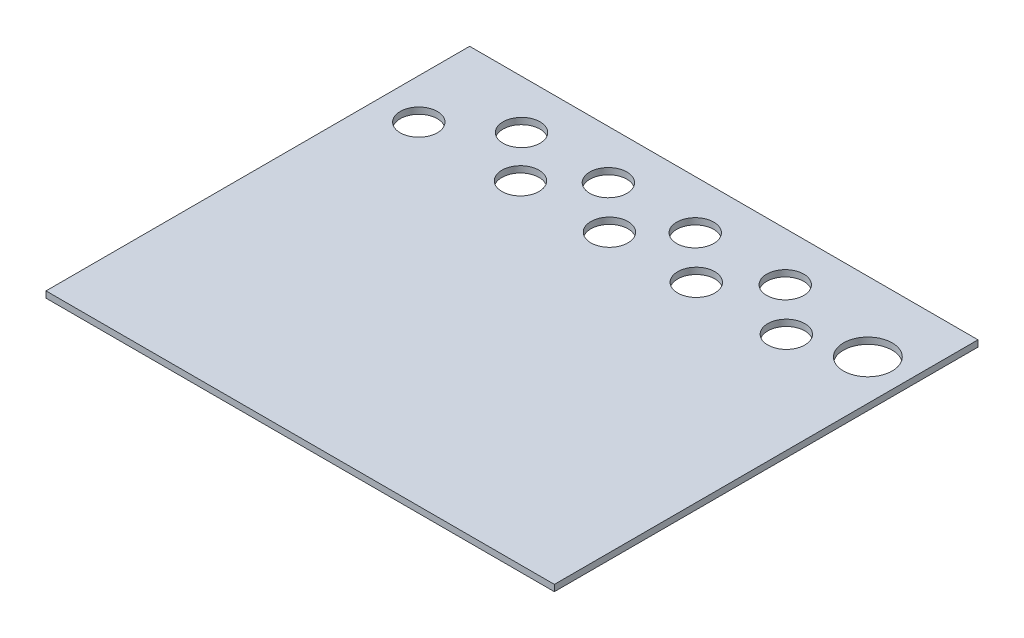
ISO-10303-21;
HEADER;
FILE_DESCRIPTION(('STEP AP214'),'2;1');
FILE_NAME('part.step','',(''),(''),'','','');
FILE_SCHEMA(('AUTOMOTIVE_DESIGN { 1 0 10303 214 1 1 1 1 }'));
ENDSEC;
DATA;
#1=APPLICATION_CONTEXT('core data for automotive mechanical design processes');
#2=APPLICATION_PROTOCOL_DEFINITION('international standard','automotive_design',2000,#1);
#3=PRODUCT_CONTEXT('',#1,'mechanical');
#4=PRODUCT('Part','Part','',(#3));
#5=PRODUCT_RELATED_PRODUCT_CATEGORY('part','',(#4));
#6=PRODUCT_DEFINITION_FORMATION('','',#4);
#7=PRODUCT_DEFINITION_CONTEXT('part definition',#1,'design');
#8=PRODUCT_DEFINITION('design','',#6,#7);
#9=PRODUCT_DEFINITION_SHAPE('','',#8);
#10=(LENGTH_UNIT() NAMED_UNIT(*) SI_UNIT(.MILLI.,.METRE.));
#11=(NAMED_UNIT(*) PLANE_ANGLE_UNIT() SI_UNIT($,.RADIAN.));
#12=(NAMED_UNIT(*) SI_UNIT($,.STERADIAN.) SOLID_ANGLE_UNIT());
#13=UNCERTAINTY_MEASURE_WITH_UNIT(LENGTH_MEASURE(1.E-05),#10,'distance_accuracy_value','');
#14=(GEOMETRIC_REPRESENTATION_CONTEXT(3) GLOBAL_UNCERTAINTY_ASSIGNED_CONTEXT((#13)) GLOBAL_UNIT_ASSIGNED_CONTEXT((#10,
#11,#12)) REPRESENTATION_CONTEXT('',''));
#15=CARTESIAN_POINT('',(0.,0.,0.));
#16=DIRECTION('',(0.,0.,1.));
#17=DIRECTION('',(1.,0.,0.));
#18=AXIS2_PLACEMENT_3D('',#15,#16,#17);
#19=CARTESIAN_POINT('',(0.,3.,0.));
#20=DIRECTION('',(1.,0.,0.));
#21=DIRECTION('',(0.,0.,-1.));
#22=AXIS2_PLACEMENT_3D('',#19,#20,#21);
#23=PLANE('',#22);
#24=DIRECTION('',(0.,0.,1.));
#25=VECTOR('',#24,1.);
#26=CARTESIAN_POINT('',(0.,0.,0.));
#27=LINE('',#26,#25);
#28=CARTESIAN_POINT('',(0.,0.,-200.));
#29=VERTEX_POINT('',#28);
#30=CARTESIAN_POINT('',(0.,0.,0.));
#31=VERTEX_POINT('',#30);
#32=EDGE_CURVE('E96',#29,#31,#27,.T.);
#33=ORIENTED_EDGE('',*,*,#32,.T.);
#34=DIRECTION('',(0.,-1.,0.));
#35=VECTOR('',#34,1.);
#36=CARTESIAN_POINT('',(0.,3.,0.));
#37=LINE('',#36,#35);
#38=CARTESIAN_POINT('',(0.,3.,0.));
#39=VERTEX_POINT('',#38);
#40=EDGE_CURVE('E11',#39,#31,#37,.T.);
#41=ORIENTED_EDGE('',*,*,#40,.F.);
#42=DIRECTION('',(0.,0.,1.));
#43=VECTOR('',#42,1.);
#44=CARTESIAN_POINT('',(0.,3.,0.));
#45=LINE('',#44,#43);
#46=CARTESIAN_POINT('',(0.,3.,-200.));
#47=VERTEX_POINT('',#46);
#48=EDGE_CURVE('E84',#47,#39,#45,.T.);
#49=ORIENTED_EDGE('',*,*,#48,.F.);
#50=DIRECTION('',(0.,-1.,0.));
#51=VECTOR('',#50,1.);
#52=CARTESIAN_POINT('',(0.,3.,-200.));
#53=LINE('',#52,#51);
#54=EDGE_CURVE('E92',#47,#29,#53,.T.);
#55=ORIENTED_EDGE('',*,*,#54,.T.);
#56=EDGE_LOOP('',(#33,#41,#49,#55));
#57=FACE_BOUND('',#56,.T.);
#58=ADVANCED_FACE('F33',(#57),#23,.F.);
#59=CARTESIAN_POINT('',(0.,3.,0.));
#60=DIRECTION('',(0.,0.,-1.));
#61=DIRECTION('',(-1.,0.,0.));
#62=AXIS2_PLACEMENT_3D('',#59,#60,#61);
#63=PLANE('',#62);
#64=DIRECTION('',(1.,0.,0.));
#65=VECTOR('',#64,1.);
#66=CARTESIAN_POINT('',(0.,0.,0.));
#67=LINE('',#66,#65);
#68=CARTESIAN_POINT('',(240.,0.,0.));
#69=VERTEX_POINT('',#68);
#70=EDGE_CURVE('E88',#31,#69,#67,.T.);
#71=ORIENTED_EDGE('',*,*,#70,.T.);
#72=DIRECTION('',(0.,-1.,0.));
#73=VECTOR('',#72,1.);
#74=CARTESIAN_POINT('',(240.,3.,0.));
#75=LINE('',#74,#73);
#76=CARTESIAN_POINT('',(240.,3.,0.));
#77=VERTEX_POINT('',#76);
#78=EDGE_CURVE('E41',#77,#69,#75,.T.);
#79=ORIENTED_EDGE('',*,*,#78,.F.);
#80=DIRECTION('',(1.,0.,0.));
#81=VECTOR('',#80,1.);
#82=CARTESIAN_POINT('',(0.,3.,0.));
#83=LINE('',#82,#81);
#84=EDGE_CURVE('E79',#39,#77,#83,.T.);
#85=ORIENTED_EDGE('',*,*,#84,.F.);
#86=ORIENTED_EDGE('',*,*,#40,.T.);
#87=EDGE_LOOP('',(#71,#79,#85,#86));
#88=FACE_BOUND('',#87,.T.);
#89=ADVANCED_FACE('F87',(#88),#63,.F.);
#90=CARTESIAN_POINT('',(240.,3.,0.));
#91=DIRECTION('',(-1.,0.,0.));
#92=DIRECTION('',(0.,0.,1.));
#93=AXIS2_PLACEMENT_3D('',#90,#91,#92);
#94=PLANE('',#93);
#95=DIRECTION('',(0.,0.,-1.));
#96=VECTOR('',#95,1.);
#97=CARTESIAN_POINT('',(240.,0.,0.));
#98=LINE('',#97,#96);
#99=CARTESIAN_POINT('',(240.,0.,-200.));
#100=VERTEX_POINT('',#99);
#101=EDGE_CURVE('E66',#69,#100,#98,.T.);
#102=ORIENTED_EDGE('',*,*,#101,.T.);
#103=DIRECTION('',(0.,-1.,0.));
#104=VECTOR('',#103,1.);
#105=CARTESIAN_POINT('',(240.,3.,-200.));
#106=LINE('',#105,#104);
#107=CARTESIAN_POINT('',(240.,3.,-200.));
#108=VERTEX_POINT('',#107);
#109=EDGE_CURVE('E89',#108,#100,#106,.T.);
#110=ORIENTED_EDGE('',*,*,#109,.F.);
#111=DIRECTION('',(0.,0.,-1.));
#112=VECTOR('',#111,1.);
#113=CARTESIAN_POINT('',(240.,3.,0.));
#114=LINE('',#113,#112);
#115=EDGE_CURVE('E82',#77,#108,#114,.T.);
#116=ORIENTED_EDGE('',*,*,#115,.F.);
#117=ORIENTED_EDGE('',*,*,#78,.T.);
#118=EDGE_LOOP('',(#102,#110,#116,#117));
#119=FACE_BOUND('',#118,.T.);
#120=ADVANCED_FACE('F90',(#119),#94,.F.);
#121=CARTESIAN_POINT('',(0.,3.,-200.));
#122=DIRECTION('',(0.,0.,1.));
#123=DIRECTION('',(1.,0.,0.));
#124=AXIS2_PLACEMENT_3D('',#121,#122,#123);
#125=PLANE('',#124);
#126=DIRECTION('',(-1.,0.,0.));
#127=VECTOR('',#126,1.);
#128=CARTESIAN_POINT('',(0.,0.,-200.));
#129=LINE('',#128,#127);
#130=EDGE_CURVE('E72',#100,#29,#129,.T.);
#131=ORIENTED_EDGE('',*,*,#130,.T.);
#132=ORIENTED_EDGE('',*,*,#54,.F.);
#133=DIRECTION('',(-1.,0.,0.));
#134=VECTOR('',#133,1.);
#135=CARTESIAN_POINT('',(0.,3.,-200.));
#136=LINE('',#135,#134);
#137=EDGE_CURVE('E49',#108,#47,#136,.T.);
#138=ORIENTED_EDGE('',*,*,#137,.F.);
#139=ORIENTED_EDGE('',*,*,#109,.T.);
#140=EDGE_LOOP('',(#131,#132,#138,#139));
#141=FACE_BOUND('',#140,.T.);
#142=ADVANCED_FACE('F104',(#141),#125,.F.);
#143=CARTESIAN_POINT('',(0.,3.,0.));
#144=DIRECTION('',(0.,-1.,0.));
#145=DIRECTION('',(0.,0.,-1.));
#146=AXIS2_PLACEMENT_3D('',#143,#144,#145);
#147=PLANE('',#146);
#148=CARTESIAN_POINT('',(221.,3.,-167.));
#149=DIRECTION('',(0.,1.,0.));
#150=DIRECTION('',(0.,0.,1.));
#151=AXIS2_PLACEMENT_3D('',#148,#149,#150);
#152=CIRCLE('',#151,11.5);
#153=CARTESIAN_POINT('',(221.,3.,-155.5));
#154=VERTEX_POINT('',#153);
#155=EDGE_CURVE('E166',#154,#154,#152,.T.);
#156=ORIENTED_EDGE('',*,*,#155,.F.);
#157=EDGE_LOOP('',(#156));
#158=FACE_BOUND('',#157,.T.);
#159=CARTESIAN_POINT('',(19.,3.,-157.));
#160=DIRECTION('',(0.,1.,0.));
#161=DIRECTION('',(0.,0.,1.));
#162=AXIS2_PLACEMENT_3D('',#159,#160,#161);
#163=CIRCLE('',#162,8.75);
#164=CARTESIAN_POINT('',(19.,3.,-148.25));
#165=VERTEX_POINT('',#164);
#166=EDGE_CURVE('E160',#165,#165,#163,.T.);
#167=ORIENTED_EDGE('',*,*,#166,.F.);
#168=EDGE_LOOP('',(#167));
#169=FACE_BOUND('',#168,.T.);
#170=CARTESIAN_POINT('',(47.5,3.,-177.));
#171=DIRECTION('',(0.,1.,0.));
#172=DIRECTION('',(0.,0.,1.));
#173=AXIS2_PLACEMENT_3D('',#170,#171,#172);
#174=CIRCLE('',#173,8.75);
#175=CARTESIAN_POINT('',(47.5,3.,-168.25));
#176=VERTEX_POINT('',#175);
#177=EDGE_CURVE('E154',#176,#176,#174,.T.);
#178=ORIENTED_EDGE('',*,*,#177,.F.);
#179=EDGE_LOOP('',(#178));
#180=FACE_BOUND('',#179,.T.);
#181=CARTESIAN_POINT('',(67.,3.,-157.));
#182=DIRECTION('',(0.,1.,0.));
#183=DIRECTION('',(0.,0.,1.));
#184=AXIS2_PLACEMENT_3D('',#181,#182,#183);
#185=CIRCLE('',#184,8.75000000000001);
#186=CARTESIAN_POINT('',(67.,3.,-148.25));
#187=VERTEX_POINT('',#186);
#188=EDGE_CURVE('E148',#187,#187,#185,.T.);
#189=ORIENTED_EDGE('',*,*,#188,.F.);
#190=EDGE_LOOP('',(#189));
#191=FACE_BOUND('',#190,.T.);
#192=CARTESIAN_POINT('',(88.5,3.,-177.));
#193=DIRECTION('',(0.,1.,0.));
#194=DIRECTION('',(0.,0.,1.));
#195=AXIS2_PLACEMENT_3D('',#192,#193,#194);
#196=CIRCLE('',#195,8.75000000000001);
#197=CARTESIAN_POINT('',(88.5,3.,-168.25));
#198=VERTEX_POINT('',#197);
#199=EDGE_CURVE('E142',#198,#198,#196,.T.);
#200=ORIENTED_EDGE('',*,*,#199,.F.);
#201=EDGE_LOOP('',(#200));
#202=FACE_BOUND('',#201,.T.);
#203=CARTESIAN_POINT('',(109.,3.,-157.));
#204=DIRECTION('',(0.,1.,0.));
#205=DIRECTION('',(0.,0.,1.));
#206=AXIS2_PLACEMENT_3D('',#203,#204,#205);
#207=CIRCLE('',#206,8.75000000000001);
#208=CARTESIAN_POINT('',(109.,3.,-148.25));
#209=VERTEX_POINT('',#208);
#210=EDGE_CURVE('E136',#209,#209,#207,.T.);
#211=ORIENTED_EDGE('',*,*,#210,.F.);
#212=EDGE_LOOP('',(#211));
#213=FACE_BOUND('',#212,.T.);
#214=CARTESIAN_POINT('',(129.5,3.,-177.));
#215=DIRECTION('',(0.,1.,0.));
#216=DIRECTION('',(0.,0.,1.));
#217=AXIS2_PLACEMENT_3D('',#214,#215,#216);
#218=CIRCLE('',#217,8.75000000000001);
#219=CARTESIAN_POINT('',(129.5,3.,-168.25));
#220=VERTEX_POINT('',#219);
#221=EDGE_CURVE('E130',#220,#220,#218,.T.);
#222=ORIENTED_EDGE('',*,*,#221,.F.);
#223=EDGE_LOOP('',(#222));
#224=FACE_BOUND('',#223,.T.);
#225=CARTESIAN_POINT('',(150.,3.,-157.));
#226=DIRECTION('',(0.,1.,0.));
#227=DIRECTION('',(0.,0.,1.));
#228=AXIS2_PLACEMENT_3D('',#225,#226,#227);
#229=CIRCLE('',#228,8.75000000000001);
#230=CARTESIAN_POINT('',(150.,3.,-148.25));
#231=VERTEX_POINT('',#230);
#232=EDGE_CURVE('E124',#231,#231,#229,.T.);
#233=ORIENTED_EDGE('',*,*,#232,.F.);
#234=EDGE_LOOP('',(#233));
#235=FACE_BOUND('',#234,.T.);
#236=CARTESIAN_POINT('',(172.,3.,-177.));
#237=DIRECTION('',(0.,1.,0.));
#238=DIRECTION('',(0.,0.,1.));
#239=AXIS2_PLACEMENT_3D('',#236,#237,#238);
#240=CIRCLE('',#239,8.75000000000001);
#241=CARTESIAN_POINT('',(172.,3.,-168.25));
#242=VERTEX_POINT('',#241);
#243=EDGE_CURVE('E118',#242,#242,#240,.T.);
#244=ORIENTED_EDGE('',*,*,#243,.F.);
#245=EDGE_LOOP('',(#244));
#246=FACE_BOUND('',#245,.T.);
#247=CARTESIAN_POINT('',(192.5,3.,-157.));
#248=DIRECTION('',(0.,1.,0.));
#249=DIRECTION('',(0.,0.,1.));
#250=AXIS2_PLACEMENT_3D('',#247,#248,#249);
#251=CIRCLE('',#250,8.75000000000001);
#252=CARTESIAN_POINT('',(192.5,3.,-148.25));
#253=VERTEX_POINT('',#252);
#254=EDGE_CURVE('E112',#253,#253,#251,.T.);
#255=ORIENTED_EDGE('',*,*,#254,.F.);
#256=EDGE_LOOP('',(#255));
#257=FACE_BOUND('',#256,.T.);
#258=ORIENTED_EDGE('',*,*,#48,.T.);
#259=ORIENTED_EDGE('',*,*,#84,.T.);
#260=ORIENTED_EDGE('',*,*,#115,.T.);
#261=ORIENTED_EDGE('',*,*,#137,.T.);
#262=EDGE_LOOP('',(#258,#259,#260,#261));
#263=FACE_BOUND('',#262,.T.);
#264=ADVANCED_FACE('F80',(#158,#169,#180,#191,#202,#213,#224,#235,#246,#257,#263),#147,.F.);
#265=CARTESIAN_POINT('',(0.,0.,0.));
#266=DIRECTION('',(0.,-1.,0.));
#267=DIRECTION('',(0.,0.,-1.));
#268=AXIS2_PLACEMENT_3D('',#265,#266,#267);
#269=PLANE('',#268);
#270=CARTESIAN_POINT('',(221.,0.,-167.));
#271=DIRECTION('',(0.,1.,0.));
#272=DIRECTION('',(0.,0.,1.));
#273=AXIS2_PLACEMENT_3D('',#270,#271,#272);
#274=CIRCLE('',#273,11.5);
#275=CARTESIAN_POINT('',(221.,0.,-155.5));
#276=VERTEX_POINT('',#275);
#277=EDGE_CURVE('E163',#276,#276,#274,.T.);
#278=ORIENTED_EDGE('',*,*,#277,.T.);
#279=EDGE_LOOP('',(#278));
#280=FACE_BOUND('',#279,.T.);
#281=CARTESIAN_POINT('',(19.,0.,-157.));
#282=DIRECTION('',(0.,1.,0.));
#283=DIRECTION('',(0.,0.,1.));
#284=AXIS2_PLACEMENT_3D('',#281,#282,#283);
#285=CIRCLE('',#284,8.75);
#286=CARTESIAN_POINT('',(19.,0.,-148.25));
#287=VERTEX_POINT('',#286);
#288=EDGE_CURVE('E157',#287,#287,#285,.T.);
#289=ORIENTED_EDGE('',*,*,#288,.T.);
#290=EDGE_LOOP('',(#289));
#291=FACE_BOUND('',#290,.T.);
#292=CARTESIAN_POINT('',(47.5,0.,-177.));
#293=DIRECTION('',(0.,1.,0.));
#294=DIRECTION('',(0.,0.,1.));
#295=AXIS2_PLACEMENT_3D('',#292,#293,#294);
#296=CIRCLE('',#295,8.75);
#297=CARTESIAN_POINT('',(47.5,0.,-168.25));
#298=VERTEX_POINT('',#297);
#299=EDGE_CURVE('E151',#298,#298,#296,.T.);
#300=ORIENTED_EDGE('',*,*,#299,.T.);
#301=EDGE_LOOP('',(#300));
#302=FACE_BOUND('',#301,.T.);
#303=CARTESIAN_POINT('',(67.,0.,-157.));
#304=DIRECTION('',(0.,1.,0.));
#305=DIRECTION('',(0.,0.,1.));
#306=AXIS2_PLACEMENT_3D('',#303,#304,#305);
#307=CIRCLE('',#306,8.75000000000001);
#308=CARTESIAN_POINT('',(67.,0.,-148.25));
#309=VERTEX_POINT('',#308);
#310=EDGE_CURVE('E145',#309,#309,#307,.T.);
#311=ORIENTED_EDGE('',*,*,#310,.T.);
#312=EDGE_LOOP('',(#311));
#313=FACE_BOUND('',#312,.T.);
#314=CARTESIAN_POINT('',(88.5,0.,-177.));
#315=DIRECTION('',(0.,1.,0.));
#316=DIRECTION('',(0.,0.,1.));
#317=AXIS2_PLACEMENT_3D('',#314,#315,#316);
#318=CIRCLE('',#317,8.75000000000001);
#319=CARTESIAN_POINT('',(88.5,0.,-168.25));
#320=VERTEX_POINT('',#319);
#321=EDGE_CURVE('E139',#320,#320,#318,.T.);
#322=ORIENTED_EDGE('',*,*,#321,.T.);
#323=EDGE_LOOP('',(#322));
#324=FACE_BOUND('',#323,.T.);
#325=CARTESIAN_POINT('',(109.,0.,-157.));
#326=DIRECTION('',(0.,1.,0.));
#327=DIRECTION('',(0.,0.,1.));
#328=AXIS2_PLACEMENT_3D('',#325,#326,#327);
#329=CIRCLE('',#328,8.75000000000001);
#330=CARTESIAN_POINT('',(109.,0.,-148.25));
#331=VERTEX_POINT('',#330);
#332=EDGE_CURVE('E133',#331,#331,#329,.T.);
#333=ORIENTED_EDGE('',*,*,#332,.T.);
#334=EDGE_LOOP('',(#333));
#335=FACE_BOUND('',#334,.T.);
#336=CARTESIAN_POINT('',(129.5,0.,-177.));
#337=DIRECTION('',(0.,1.,0.));
#338=DIRECTION('',(0.,0.,1.));
#339=AXIS2_PLACEMENT_3D('',#336,#337,#338);
#340=CIRCLE('',#339,8.75000000000001);
#341=CARTESIAN_POINT('',(129.5,0.,-168.25));
#342=VERTEX_POINT('',#341);
#343=EDGE_CURVE('E127',#342,#342,#340,.T.);
#344=ORIENTED_EDGE('',*,*,#343,.T.);
#345=EDGE_LOOP('',(#344));
#346=FACE_BOUND('',#345,.T.);
#347=CARTESIAN_POINT('',(150.,0.,-157.));
#348=DIRECTION('',(0.,1.,0.));
#349=DIRECTION('',(0.,0.,1.));
#350=AXIS2_PLACEMENT_3D('',#347,#348,#349);
#351=CIRCLE('',#350,8.75000000000001);
#352=CARTESIAN_POINT('',(150.,0.,-148.25));
#353=VERTEX_POINT('',#352);
#354=EDGE_CURVE('E121',#353,#353,#351,.T.);
#355=ORIENTED_EDGE('',*,*,#354,.T.);
#356=EDGE_LOOP('',(#355));
#357=FACE_BOUND('',#356,.T.);
#358=CARTESIAN_POINT('',(172.,0.,-177.));
#359=DIRECTION('',(0.,1.,0.));
#360=DIRECTION('',(0.,0.,1.));
#361=AXIS2_PLACEMENT_3D('',#358,#359,#360);
#362=CIRCLE('',#361,8.75000000000001);
#363=CARTESIAN_POINT('',(172.,0.,-168.25));
#364=VERTEX_POINT('',#363);
#365=EDGE_CURVE('E115',#364,#364,#362,.T.);
#366=ORIENTED_EDGE('',*,*,#365,.T.);
#367=EDGE_LOOP('',(#366));
#368=FACE_BOUND('',#367,.T.);
#369=CARTESIAN_POINT('',(192.5,0.,-157.));
#370=DIRECTION('',(0.,1.,0.));
#371=DIRECTION('',(0.,0.,1.));
#372=AXIS2_PLACEMENT_3D('',#369,#370,#371);
#373=CIRCLE('',#372,8.75000000000001);
#374=CARTESIAN_POINT('',(192.5,0.,-148.25));
#375=VERTEX_POINT('',#374);
#376=EDGE_CURVE('E99',#375,#375,#373,.T.);
#377=ORIENTED_EDGE('',*,*,#376,.T.);
#378=EDGE_LOOP('',(#377));
#379=FACE_BOUND('',#378,.T.);
#380=ORIENTED_EDGE('',*,*,#32,.F.);
#381=ORIENTED_EDGE('',*,*,#130,.F.);
#382=ORIENTED_EDGE('',*,*,#101,.F.);
#383=ORIENTED_EDGE('',*,*,#70,.F.);
#384=EDGE_LOOP('',(#380,#381,#382,#383));
#385=FACE_BOUND('',#384,.T.);
#386=ADVANCED_FACE('F107',(#280,#291,#302,#313,#324,#335,#346,#357,#368,#379,#385),#269,.T.);
#387=CARTESIAN_POINT('',(192.5,3.,-157.));
#388=DIRECTION('',(0.,1.,0.));
#389=DIRECTION('',(0.,0.,1.));
#390=AXIS2_PLACEMENT_3D('',#387,#388,#389);
#391=CYLINDRICAL_SURFACE('',#390,8.75000000000001);
#392=ORIENTED_EDGE('',*,*,#376,.F.);
#393=EDGE_LOOP('',(#392));
#394=FACE_BOUND('',#393,.T.);
#395=ORIENTED_EDGE('',*,*,#254,.T.);
#396=EDGE_LOOP('',(#395));
#397=FACE_BOUND('',#396,.T.);
#398=ADVANCED_FACE('F193',(#394,#397),#391,.F.);
#399=CARTESIAN_POINT('',(172.,3.,-177.));
#400=DIRECTION('',(0.,1.,0.));
#401=DIRECTION('',(0.,0.,1.));
#402=AXIS2_PLACEMENT_3D('',#399,#400,#401);
#403=CYLINDRICAL_SURFACE('',#402,8.75000000000001);
#404=ORIENTED_EDGE('',*,*,#365,.F.);
#405=EDGE_LOOP('',(#404));
#406=FACE_BOUND('',#405,.T.);
#407=ORIENTED_EDGE('',*,*,#243,.T.);
#408=EDGE_LOOP('',(#407));
#409=FACE_BOUND('',#408,.T.);
#410=ADVANCED_FACE('F195',(#406,#409),#403,.F.);
#411=CARTESIAN_POINT('',(150.,3.,-157.));
#412=DIRECTION('',(0.,1.,0.));
#413=DIRECTION('',(0.,0.,1.));
#414=AXIS2_PLACEMENT_3D('',#411,#412,#413);
#415=CYLINDRICAL_SURFACE('',#414,8.75000000000001);
#416=ORIENTED_EDGE('',*,*,#354,.F.);
#417=EDGE_LOOP('',(#416));
#418=FACE_BOUND('',#417,.T.);
#419=ORIENTED_EDGE('',*,*,#232,.T.);
#420=EDGE_LOOP('',(#419));
#421=FACE_BOUND('',#420,.T.);
#422=ADVANCED_FACE('F202',(#418,#421),#415,.F.);
#423=CARTESIAN_POINT('',(129.5,3.,-177.));
#424=DIRECTION('',(0.,1.,0.));
#425=DIRECTION('',(0.,0.,1.));
#426=AXIS2_PLACEMENT_3D('',#423,#424,#425);
#427=CYLINDRICAL_SURFACE('',#426,8.75000000000001);
#428=ORIENTED_EDGE('',*,*,#343,.F.);
#429=EDGE_LOOP('',(#428));
#430=FACE_BOUND('',#429,.T.);
#431=ORIENTED_EDGE('',*,*,#221,.T.);
#432=EDGE_LOOP('',(#431));
#433=FACE_BOUND('',#432,.T.);
#434=ADVANCED_FACE('F281',(#430,#433),#427,.F.);
#435=CARTESIAN_POINT('',(109.,3.,-157.));
#436=DIRECTION('',(0.,1.,0.));
#437=DIRECTION('',(0.,0.,1.));
#438=AXIS2_PLACEMENT_3D('',#435,#436,#437);
#439=CYLINDRICAL_SURFACE('',#438,8.75000000000001);
#440=ORIENTED_EDGE('',*,*,#332,.F.);
#441=EDGE_LOOP('',(#440));
#442=FACE_BOUND('',#441,.T.);
#443=ORIENTED_EDGE('',*,*,#210,.T.);
#444=EDGE_LOOP('',(#443));
#445=FACE_BOUND('',#444,.T.);
#446=ADVANCED_FACE('F273',(#442,#445),#439,.F.);
#447=CARTESIAN_POINT('',(88.5,3.,-177.));
#448=DIRECTION('',(0.,1.,0.));
#449=DIRECTION('',(0.,0.,1.));
#450=AXIS2_PLACEMENT_3D('',#447,#448,#449);
#451=CYLINDRICAL_SURFACE('',#450,8.75000000000001);
#452=ORIENTED_EDGE('',*,*,#321,.F.);
#453=EDGE_LOOP('',(#452));
#454=FACE_BOUND('',#453,.T.);
#455=ORIENTED_EDGE('',*,*,#199,.T.);
#456=EDGE_LOOP('',(#455));
#457=FACE_BOUND('',#456,.T.);
#458=ADVANCED_FACE('F265',(#454,#457),#451,.F.);
#459=CARTESIAN_POINT('',(67.,3.,-157.));
#460=DIRECTION('',(0.,1.,0.));
#461=DIRECTION('',(0.,0.,1.));
#462=AXIS2_PLACEMENT_3D('',#459,#460,#461);
#463=CYLINDRICAL_SURFACE('',#462,8.75000000000001);
#464=ORIENTED_EDGE('',*,*,#310,.F.);
#465=EDGE_LOOP('',(#464));
#466=FACE_BOUND('',#465,.T.);
#467=ORIENTED_EDGE('',*,*,#188,.T.);
#468=EDGE_LOOP('',(#467));
#469=FACE_BOUND('',#468,.T.);
#470=ADVANCED_FACE('F257',(#466,#469),#463,.F.);
#471=CARTESIAN_POINT('',(47.5,3.,-177.));
#472=DIRECTION('',(0.,1.,0.));
#473=DIRECTION('',(0.,0.,1.));
#474=AXIS2_PLACEMENT_3D('',#471,#472,#473);
#475=CYLINDRICAL_SURFACE('',#474,8.75);
#476=ORIENTED_EDGE('',*,*,#299,.F.);
#477=EDGE_LOOP('',(#476));
#478=FACE_BOUND('',#477,.T.);
#479=ORIENTED_EDGE('',*,*,#177,.T.);
#480=EDGE_LOOP('',(#479));
#481=FACE_BOUND('',#480,.T.);
#482=ADVANCED_FACE('F250',(#478,#481),#475,.F.);
#483=CARTESIAN_POINT('',(19.,3.,-157.));
#484=DIRECTION('',(0.,1.,0.));
#485=DIRECTION('',(0.,0.,1.));
#486=AXIS2_PLACEMENT_3D('',#483,#484,#485);
#487=CYLINDRICAL_SURFACE('',#486,8.75);
#488=ORIENTED_EDGE('',*,*,#288,.F.);
#489=EDGE_LOOP('',(#488));
#490=FACE_BOUND('',#489,.T.);
#491=ORIENTED_EDGE('',*,*,#166,.T.);
#492=EDGE_LOOP('',(#491));
#493=FACE_BOUND('',#492,.T.);
#494=ADVANCED_FACE('F240',(#490,#493),#487,.F.);
#495=CARTESIAN_POINT('',(221.,3.,-167.));
#496=DIRECTION('',(0.,1.,0.));
#497=DIRECTION('',(0.,0.,1.));
#498=AXIS2_PLACEMENT_3D('',#495,#496,#497);
#499=CYLINDRICAL_SURFACE('',#498,11.5);
#500=ORIENTED_EDGE('',*,*,#277,.F.);
#501=EDGE_LOOP('',(#500));
#502=FACE_BOUND('',#501,.T.);
#503=ORIENTED_EDGE('',*,*,#155,.T.);
#504=EDGE_LOOP('',(#503));
#505=FACE_BOUND('',#504,.T.);
#506=ADVANCED_FACE('F170',(#502,#505),#499,.F.);
#507=CLOSED_SHELL('',(#58,#89,#120,#142,#264,#386,#398,#410,#422,#434,#446,#458,#470,#482,#494,#506));
#508=MANIFOLD_SOLID_BREP('B2',#507);
#509=ADVANCED_BREP_SHAPE_REPRESENTATION('',(#18,#508),#14);
#510=SHAPE_DEFINITION_REPRESENTATION(#9,#509);
ENDSEC;
END-ISO-10303-21;
